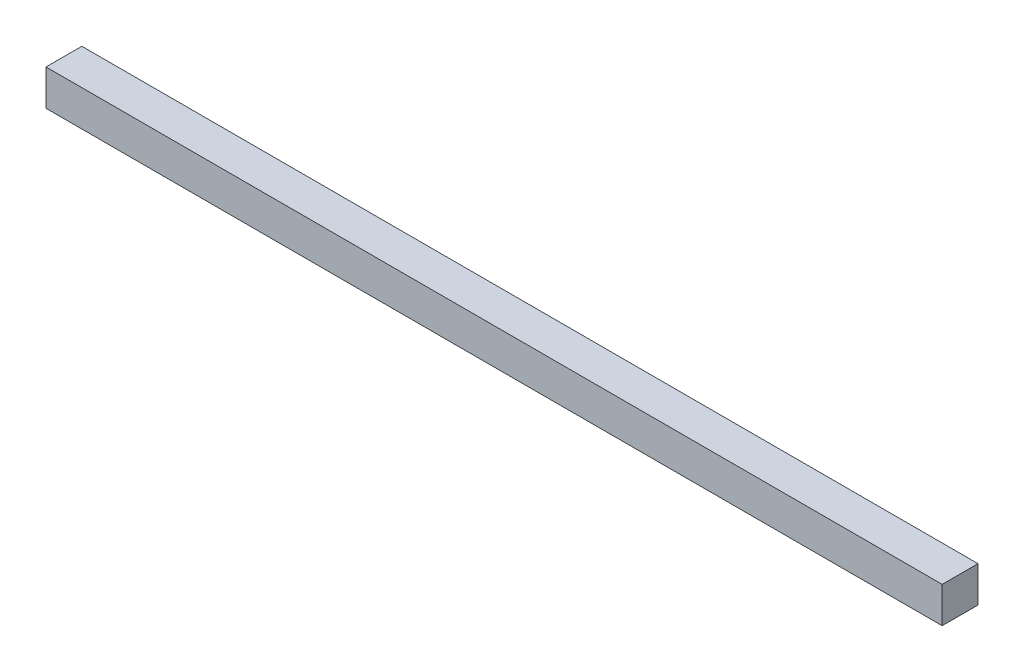
ISO-10303-21;
HEADER;
FILE_DESCRIPTION(('STEP AP214'),'2;1');
FILE_NAME('part.step','',(''),(''),'','','');
FILE_SCHEMA(('AUTOMOTIVE_DESIGN { 1 0 10303 214 1 1 1 1 }'));
ENDSEC;
DATA;
#1=APPLICATION_CONTEXT('core data for automotive mechanical design processes');
#2=APPLICATION_PROTOCOL_DEFINITION('international standard','automotive_design',2000,#1);
#3=PRODUCT_CONTEXT('',#1,'mechanical');
#4=PRODUCT('Part','Part','',(#3));
#5=PRODUCT_RELATED_PRODUCT_CATEGORY('part','',(#4));
#6=PRODUCT_DEFINITION_FORMATION('','',#4);
#7=PRODUCT_DEFINITION_CONTEXT('part definition',#1,'design');
#8=PRODUCT_DEFINITION('design','',#6,#7);
#9=PRODUCT_DEFINITION_SHAPE('','',#8);
#10=(LENGTH_UNIT() NAMED_UNIT(*) SI_UNIT(.MILLI.,.METRE.));
#11=(NAMED_UNIT(*) PLANE_ANGLE_UNIT() SI_UNIT($,.RADIAN.));
#12=(NAMED_UNIT(*) SI_UNIT($,.STERADIAN.) SOLID_ANGLE_UNIT());
#13=UNCERTAINTY_MEASURE_WITH_UNIT(LENGTH_MEASURE(1.E-05),#10,'distance_accuracy_value','');
#14=(GEOMETRIC_REPRESENTATION_CONTEXT(3) GLOBAL_UNCERTAINTY_ASSIGNED_CONTEXT((#13)) GLOBAL_UNIT_ASSIGNED_CONTEXT((#10,
#11,#12)) REPRESENTATION_CONTEXT('',''));
#15=CARTESIAN_POINT('',(0.,0.,0.));
#16=DIRECTION('',(0.,0.,1.));
#17=DIRECTION('',(1.,0.,0.));
#18=AXIS2_PLACEMENT_3D('',#15,#16,#17);
#19=CARTESIAN_POINT('',(0.,0.,4.));
#20=DIRECTION('',(1.,0.,0.));
#21=DIRECTION('',(0.,0.,-1.));
#22=AXIS2_PLACEMENT_3D('',#19,#20,#21);
#23=PLANE('',#22);
#24=DIRECTION('',(0.,-1.,0.));
#25=VECTOR('',#24,1.);
#26=CARTESIAN_POINT('',(0.,0.,0.));
#27=LINE('',#26,#25);
#28=CARTESIAN_POINT('',(0.,4.,0.));
#29=VERTEX_POINT('',#28);
#30=CARTESIAN_POINT('',(0.,0.,0.));
#31=VERTEX_POINT('',#30);
#32=EDGE_CURVE('E96',#29,#31,#27,.T.);
#33=ORIENTED_EDGE('',*,*,#32,.T.);
#34=DIRECTION('',(0.,0.,-1.));
#35=VECTOR('',#34,1.);
#36=CARTESIAN_POINT('',(0.,0.,4.));
#37=LINE('',#36,#35);
#38=CARTESIAN_POINT('',(0.,0.,4.));
#39=VERTEX_POINT('',#38);
#40=EDGE_CURVE('E11',#39,#31,#37,.T.);
#41=ORIENTED_EDGE('',*,*,#40,.F.);
#42=DIRECTION('',(0.,-1.,0.));
#43=VECTOR('',#42,1.);
#44=CARTESIAN_POINT('',(0.,0.,4.));
#45=LINE('',#44,#43);
#46=CARTESIAN_POINT('',(0.,4.,4.));
#47=VERTEX_POINT('',#46);
#48=EDGE_CURVE('E84',#47,#39,#45,.T.);
#49=ORIENTED_EDGE('',*,*,#48,.F.);
#50=DIRECTION('',(0.,0.,-1.));
#51=VECTOR('',#50,1.);
#52=CARTESIAN_POINT('',(0.,4.,4.));
#53=LINE('',#52,#51);
#54=EDGE_CURVE('E92',#47,#29,#53,.T.);
#55=ORIENTED_EDGE('',*,*,#54,.T.);
#56=EDGE_LOOP('',(#33,#41,#49,#55));
#57=FACE_BOUND('',#56,.T.);
#58=ADVANCED_FACE('F33',(#57),#23,.F.);
#59=CARTESIAN_POINT('',(0.,0.,4.));
#60=DIRECTION('',(0.,1.,0.));
#61=DIRECTION('',(0.,0.,1.));
#62=AXIS2_PLACEMENT_3D('',#59,#60,#61);
#63=PLANE('',#62);
#64=DIRECTION('',(1.,0.,0.));
#65=VECTOR('',#64,1.);
#66=CARTESIAN_POINT('',(0.,0.,0.));
#67=LINE('',#66,#65);
#68=CARTESIAN_POINT('',(100.,0.,0.));
#69=VERTEX_POINT('',#68);
#70=EDGE_CURVE('E88',#31,#69,#67,.T.);
#71=ORIENTED_EDGE('',*,*,#70,.T.);
#72=DIRECTION('',(0.,0.,-1.));
#73=VECTOR('',#72,1.);
#74=CARTESIAN_POINT('',(100.,0.,4.));
#75=LINE('',#74,#73);
#76=CARTESIAN_POINT('',(100.,0.,4.));
#77=VERTEX_POINT('',#76);
#78=EDGE_CURVE('E41',#77,#69,#75,.T.);
#79=ORIENTED_EDGE('',*,*,#78,.F.);
#80=DIRECTION('',(1.,0.,0.));
#81=VECTOR('',#80,1.);
#82=CARTESIAN_POINT('',(0.,0.,4.));
#83=LINE('',#82,#81);
#84=EDGE_CURVE('E79',#39,#77,#83,.T.);
#85=ORIENTED_EDGE('',*,*,#84,.F.);
#86=ORIENTED_EDGE('',*,*,#40,.T.);
#87=EDGE_LOOP('',(#71,#79,#85,#86));
#88=FACE_BOUND('',#87,.T.);
#89=ADVANCED_FACE('F87',(#88),#63,.F.);
#90=CARTESIAN_POINT('',(100.,0.,4.));
#91=DIRECTION('',(-1.,0.,0.));
#92=DIRECTION('',(0.,0.,1.));
#93=AXIS2_PLACEMENT_3D('',#90,#91,#92);
#94=PLANE('',#93);
#95=DIRECTION('',(0.,1.,0.));
#96=VECTOR('',#95,1.);
#97=CARTESIAN_POINT('',(100.,0.,0.));
#98=LINE('',#97,#96);
#99=CARTESIAN_POINT('',(100.,4.,0.));
#100=VERTEX_POINT('',#99);
#101=EDGE_CURVE('E66',#69,#100,#98,.T.);
#102=ORIENTED_EDGE('',*,*,#101,.T.);
#103=DIRECTION('',(0.,0.,-1.));
#104=VECTOR('',#103,1.);
#105=CARTESIAN_POINT('',(100.,4.,4.));
#106=LINE('',#105,#104);
#107=CARTESIAN_POINT('',(100.,4.,4.));
#108=VERTEX_POINT('',#107);
#109=EDGE_CURVE('E89',#108,#100,#106,.T.);
#110=ORIENTED_EDGE('',*,*,#109,.F.);
#111=DIRECTION('',(0.,1.,0.));
#112=VECTOR('',#111,1.);
#113=CARTESIAN_POINT('',(100.,0.,4.));
#114=LINE('',#113,#112);
#115=EDGE_CURVE('E82',#77,#108,#114,.T.);
#116=ORIENTED_EDGE('',*,*,#115,.F.);
#117=ORIENTED_EDGE('',*,*,#78,.T.);
#118=EDGE_LOOP('',(#102,#110,#116,#117));
#119=FACE_BOUND('',#118,.T.);
#120=ADVANCED_FACE('F90',(#119),#94,.F.);
#121=CARTESIAN_POINT('',(0.,4.,4.));
#122=DIRECTION('',(0.,-1.,0.));
#123=DIRECTION('',(0.,0.,-1.));
#124=AXIS2_PLACEMENT_3D('',#121,#122,#123);
#125=PLANE('',#124);
#126=DIRECTION('',(-1.,0.,0.));
#127=VECTOR('',#126,1.);
#128=CARTESIAN_POINT('',(0.,4.,0.));
#129=LINE('',#128,#127);
#130=EDGE_CURVE('E72',#100,#29,#129,.T.);
#131=ORIENTED_EDGE('',*,*,#130,.T.);
#132=ORIENTED_EDGE('',*,*,#54,.F.);
#133=DIRECTION('',(-1.,0.,0.));
#134=VECTOR('',#133,1.);
#135=CARTESIAN_POINT('',(0.,4.,4.));
#136=LINE('',#135,#134);
#137=EDGE_CURVE('E49',#108,#47,#136,.T.);
#138=ORIENTED_EDGE('',*,*,#137,.F.);
#139=ORIENTED_EDGE('',*,*,#109,.T.);
#140=EDGE_LOOP('',(#131,#132,#138,#139));
#141=FACE_BOUND('',#140,.T.);
#142=ADVANCED_FACE('F103',(#141),#125,.F.);
#143=CARTESIAN_POINT('',(0.,0.,4.));
#144=DIRECTION('',(0.,0.,-1.));
#145=DIRECTION('',(-1.,0.,0.));
#146=AXIS2_PLACEMENT_3D('',#143,#144,#145);
#147=PLANE('',#146);
#148=ORIENTED_EDGE('',*,*,#48,.T.);
#149=ORIENTED_EDGE('',*,*,#84,.T.);
#150=ORIENTED_EDGE('',*,*,#115,.T.);
#151=ORIENTED_EDGE('',*,*,#137,.T.);
#152=EDGE_LOOP('',(#148,#149,#150,#151));
#153=FACE_BOUND('',#152,.T.);
#154=ADVANCED_FACE('F80',(#153),#147,.F.);
#155=CARTESIAN_POINT('',(0.,0.,0.));
#156=DIRECTION('',(0.,0.,-1.));
#157=DIRECTION('',(-1.,0.,0.));
#158=AXIS2_PLACEMENT_3D('',#155,#156,#157);
#159=PLANE('',#158);
#160=ORIENTED_EDGE('',*,*,#32,.F.);
#161=ORIENTED_EDGE('',*,*,#130,.F.);
#162=ORIENTED_EDGE('',*,*,#101,.F.);
#163=ORIENTED_EDGE('',*,*,#70,.F.);
#164=EDGE_LOOP('',(#160,#161,#162,#163));
#165=FACE_BOUND('',#164,.T.);
#166=ADVANCED_FACE('F106',(#165),#159,.T.);
#167=CLOSED_SHELL('',(#58,#89,#120,#142,#154,#166));
#168=MANIFOLD_SOLID_BREP('B2',#167);
#169=ADVANCED_BREP_SHAPE_REPRESENTATION('',(#18,#168),#14);
#170=SHAPE_DEFINITION_REPRESENTATION(#9,#169);
ENDSEC;
END-ISO-10303-21;
